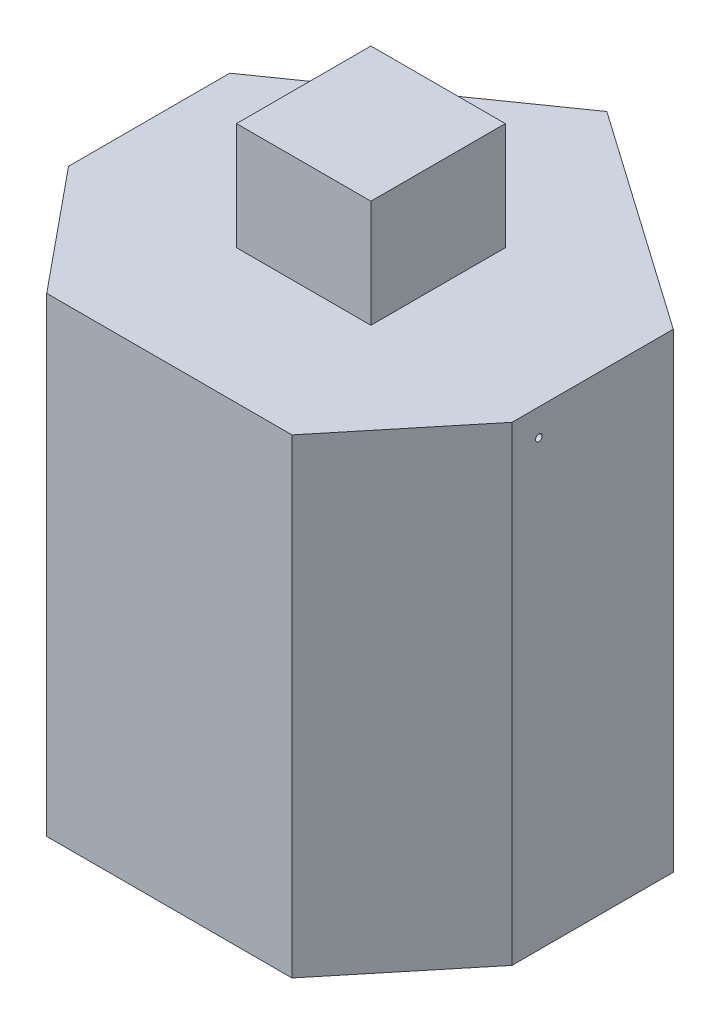
ISO-10303-21;
HEADER;
FILE_DESCRIPTION(('STEP AP214'),'2;1');
FILE_NAME('part.step','',(''),(''),'','','');
FILE_SCHEMA(('AUTOMOTIVE_DESIGN { 1 0 10303 214 1 1 1 1 }'));
ENDSEC;
DATA;
#1=APPLICATION_CONTEXT('core data for automotive mechanical design processes');
#2=APPLICATION_PROTOCOL_DEFINITION('international standard','automotive_design',2000,#1);
#3=PRODUCT_CONTEXT('',#1,'mechanical');
#4=PRODUCT('Part','Part','',(#3));
#5=PRODUCT_RELATED_PRODUCT_CATEGORY('part','',(#4));
#6=PRODUCT_DEFINITION_FORMATION('','',#4);
#7=PRODUCT_DEFINITION_CONTEXT('part definition',#1,'design');
#8=PRODUCT_DEFINITION('design','',#6,#7);
#9=PRODUCT_DEFINITION_SHAPE('','',#8);
#10=(LENGTH_UNIT() NAMED_UNIT(*) SI_UNIT(.MILLI.,.METRE.));
#11=(NAMED_UNIT(*) PLANE_ANGLE_UNIT() SI_UNIT($,.RADIAN.));
#12=(NAMED_UNIT(*) SI_UNIT($,.STERADIAN.) SOLID_ANGLE_UNIT());
#13=UNCERTAINTY_MEASURE_WITH_UNIT(LENGTH_MEASURE(1.E-05),#10,'distance_accuracy_value','');
#14=(GEOMETRIC_REPRESENTATION_CONTEXT(3) GLOBAL_UNCERTAINTY_ASSIGNED_CONTEXT((#13)) GLOBAL_UNIT_ASSIGNED_CONTEXT((#10,
#11,#12)) REPRESENTATION_CONTEXT('',''));
#15=CARTESIAN_POINT('',(0.,0.,0.));
#16=DIRECTION('',(0.,0.,1.));
#17=DIRECTION('',(1.,0.,0.));
#18=AXIS2_PLACEMENT_3D('',#15,#16,#17);
#19=CARTESIAN_POINT('',(0.,350.,0.));
#20=DIRECTION('',(0.,1.,0.));
#21=DIRECTION('',(0.,0.,1.));
#22=AXIS2_PLACEMENT_3D('',#19,#20,#21);
#23=PLANE('',#22);
#24=DIRECTION('',(-0.819067476795015,0.,-0.573697192303264));
#25=VECTOR('',#24,1.);
#26=CARTESIAN_POINT('',(0.,350.,-175.570498660794));
#27=LINE('',#26,#25);
#28=CARTESIAN_POINT('',(165.,350.,-60.));
#29=VERTEX_POINT('',#28);
#30=CARTESIAN_POINT('',(0.,350.,-175.570498660794));
#31=VERTEX_POINT('',#30);
#32=EDGE_CURVE('E189',#29,#31,#27,.T.);
#33=ORIENTED_EDGE('',*,*,#32,.T.);
#34=DIRECTION('',(-0.819067476795015,0.,0.573697192303264));
#35=VECTOR('',#34,1.);
#36=CARTESIAN_POINT('',(-165.,350.,-60.));
#37=LINE('',#36,#35);
#38=CARTESIAN_POINT('',(-165.,350.,-60.));
#39=VERTEX_POINT('',#38);
#40=EDGE_CURVE('E213',#31,#39,#37,.T.);
#41=ORIENTED_EDGE('',*,*,#40,.T.);
#42=DIRECTION('',(0.,0.,1.));
#43=VECTOR('',#42,1.);
#44=CARTESIAN_POINT('',(-165.,350.,60.));
#45=LINE('',#44,#43);
#46=CARTESIAN_POINT('',(-165.,350.,60.));
#47=VERTEX_POINT('',#46);
#48=EDGE_CURVE('E211',#39,#47,#45,.T.);
#49=ORIENTED_EDGE('',*,*,#48,.T.);
#50=DIRECTION('',(0.633866630860116,0.,0.773442366490255));
#51=VECTOR('',#50,1.);
#52=CARTESIAN_POINT('',(-165.,350.,60.));
#53=LINE('',#52,#51);
#54=CARTESIAN_POINT('',(-91.2414379544734,350.,150.));
#55=VERTEX_POINT('',#54);
#56=EDGE_CURVE('E209',#47,#55,#53,.T.);
#57=ORIENTED_EDGE('',*,*,#56,.T.);
#58=DIRECTION('',(1.,0.,0.));
#59=VECTOR('',#58,1.);
#60=CARTESIAN_POINT('',(-91.2414379544734,350.,150.));
#61=LINE('',#60,#59);
#62=CARTESIAN_POINT('',(91.2414379544733,350.,150.));
#63=VERTEX_POINT('',#62);
#64=EDGE_CURVE('E207',#55,#63,#61,.T.);
#65=ORIENTED_EDGE('',*,*,#64,.T.);
#66=DIRECTION('',(0.633866630860116,0.,-0.773442366490255));
#67=VECTOR('',#66,1.);
#68=CARTESIAN_POINT('',(91.2414379544733,350.,150.));
#69=LINE('',#68,#67);
#70=CARTESIAN_POINT('',(165.,350.,60.));
#71=VERTEX_POINT('',#70);
#72=EDGE_CURVE('E205',#63,#71,#69,.T.);
#73=ORIENTED_EDGE('',*,*,#72,.T.);
#74=DIRECTION('',(0.,0.,-1.));
#75=VECTOR('',#74,1.);
#76=CARTESIAN_POINT('',(165.,350.,60.));
#77=LINE('',#76,#75);
#78=EDGE_CURVE('E186',#71,#29,#77,.T.);
#79=ORIENTED_EDGE('',*,*,#78,.T.);
#80=EDGE_LOOP('',(#33,#41,#49,#57,#65,#73,#79));
#81=FACE_BOUND('',#80,.T.);
#82=DIRECTION('',(1.,0.,0.));
#83=VECTOR('',#82,1.);
#84=CARTESIAN_POINT('',(0.,350.,-50.));
#85=LINE('',#84,#83);
#86=CARTESIAN_POINT('',(-50.,350.,-50.));
#87=VERTEX_POINT('',#86);
#88=CARTESIAN_POINT('',(50.,350.,-50.));
#89=VERTEX_POINT('',#88);
#90=EDGE_CURVE('E219',#87,#89,#85,.T.);
#91=ORIENTED_EDGE('',*,*,#90,.T.);
#92=DIRECTION('',(0.,0.,1.));
#93=VECTOR('',#92,1.);
#94=CARTESIAN_POINT('',(50.,350.,0.));
#95=LINE('',#94,#93);
#96=CARTESIAN_POINT('',(50.,350.,50.));
#97=VERTEX_POINT('',#96);
#98=EDGE_CURVE('E203',#89,#97,#95,.T.);
#99=ORIENTED_EDGE('',*,*,#98,.T.);
#100=DIRECTION('',(-1.,0.,0.));
#101=VECTOR('',#100,1.);
#102=CARTESIAN_POINT('',(0.,350.,50.));
#103=LINE('',#102,#101);
#104=CARTESIAN_POINT('',(-50.,350.,50.));
#105=VERTEX_POINT('',#104);
#106=EDGE_CURVE('E225',#97,#105,#103,.T.);
#107=ORIENTED_EDGE('',*,*,#106,.T.);
#108=DIRECTION('',(0.,0.,-1.));
#109=VECTOR('',#108,1.);
#110=CARTESIAN_POINT('',(-50.,350.,0.));
#111=LINE('',#110,#109);
#112=EDGE_CURVE('E222',#105,#87,#111,.T.);
#113=ORIENTED_EDGE('',*,*,#112,.T.);
#114=EDGE_LOOP('',(#91,#99,#107,#113));
#115=FACE_BOUND('',#114,.T.);
#116=ADVANCED_FACE('F32',(#81,#115),#23,.T.);
#117=CARTESIAN_POINT('',(0.,350.,-175.570498660794));
#118=DIRECTION('',(-0.573697192303264,0.,0.819067476795015));
#119=DIRECTION('',(0.819067476795015,0.,0.573697192303264));
#120=AXIS2_PLACEMENT_3D('',#117,#118,#119);
#121=PLANE('',#120);
#122=DIRECTION('',(-0.819067476795015,0.,-0.573697192303264));
#123=VECTOR('',#122,1.);
#124=CARTESIAN_POINT('',(0.,0.,-175.570498660794));
#125=LINE('',#124,#123);
#126=CARTESIAN_POINT('',(165.,0.,-60.));
#127=VERTEX_POINT('',#126);
#128=CARTESIAN_POINT('',(79.3380004869838,0.,-120.));
#129=VERTEX_POINT('',#128);
#130=EDGE_CURVE('E200',#127,#129,#125,.T.);
#131=ORIENTED_EDGE('',*,*,#130,.T.);
#132=DIRECTION('',(0.,1.,0.));
#133=VECTOR('',#132,1.);
#134=CARTESIAN_POINT('',(79.3380004869838,350.,-120.));
#135=LINE('',#134,#133);
#136=CARTESIAN_POINT('',(79.3380004869837,280.,-120.));
#137=VERTEX_POINT('',#136);
#138=EDGE_CURVE('E47',#129,#137,#135,.T.);
#139=ORIENTED_EDGE('',*,*,#138,.T.);
#140=DIRECTION('',(0.819067476795015,0.,0.573697192303264));
#141=VECTOR('',#140,1.);
#142=CARTESIAN_POINT('',(0.,280.,-175.570498660794));
#143=LINE('',#142,#141);
#144=CARTESIAN_POINT('',(157.861500040582,280.,-65.));
#145=VERTEX_POINT('',#144);
#146=EDGE_CURVE('E152',#137,#145,#143,.T.);
#147=ORIENTED_EDGE('',*,*,#146,.T.);
#148=DIRECTION('',(0.,1.,0.));
#149=VECTOR('',#148,1.);
#150=CARTESIAN_POINT('',(157.861500040582,350.,-65.));
#151=LINE('',#150,#149);
#152=CARTESIAN_POINT('',(157.861500040582,340.,-65.));
#153=VERTEX_POINT('',#152);
#154=EDGE_CURVE('E248',#145,#153,#151,.T.);
#155=ORIENTED_EDGE('',*,*,#154,.T.);
#156=DIRECTION('',(-0.819067476795015,0.,-0.573697192303264));
#157=VECTOR('',#156,1.);
#158=CARTESIAN_POINT('',(0.,340.,-175.570498660794));
#159=LINE('',#158,#157);
#160=CARTESIAN_POINT('',(0.,340.,-175.570498660794));
#161=VERTEX_POINT('',#160);
#162=EDGE_CURVE('E251',#153,#161,#159,.T.);
#163=ORIENTED_EDGE('',*,*,#162,.T.);
#164=DIRECTION('',(0.,-1.,0.));
#165=VECTOR('',#164,1.);
#166=CARTESIAN_POINT('',(0.,350.,-175.570498660794));
#167=LINE('',#166,#165);
#168=EDGE_CURVE('E166',#31,#161,#167,.T.);
#169=ORIENTED_EDGE('',*,*,#168,.F.);
#170=ORIENTED_EDGE('',*,*,#32,.F.);
#171=DIRECTION('',(0.,-1.,0.));
#172=VECTOR('',#171,1.);
#173=CARTESIAN_POINT('',(165.,350.,-60.));
#174=LINE('',#173,#172);
#175=EDGE_CURVE('E183',#29,#127,#174,.T.);
#176=ORIENTED_EDGE('',*,*,#175,.T.);
#177=EDGE_LOOP('',(#131,#139,#147,#155,#163,#169,#170,#176));
#178=FACE_BOUND('',#177,.T.);
#179=ADVANCED_FACE('F34',(#178),#121,.F.);
#180=CARTESIAN_POINT('',(-165.,350.,-60.));
#181=DIRECTION('',(0.573697192303264,0.,0.819067476795015));
#182=DIRECTION('',(0.819067476795015,0.,-0.573697192303264));
#183=AXIS2_PLACEMENT_3D('',#180,#181,#182);
#184=PLANE('',#183);
#185=DIRECTION('',(0.819067476795015,0.,-0.573697192303264));
#186=VECTOR('',#185,1.);
#187=CARTESIAN_POINT('',(-165.,280.,-60.));
#188=LINE('',#187,#186);
#189=CARTESIAN_POINT('',(-157.861500040582,280.,-65.));
#190=VERTEX_POINT('',#189);
#191=CARTESIAN_POINT('',(-79.3380004869839,280.,-120.));
#192=VERTEX_POINT('',#191);
#193=EDGE_CURVE('E11',#190,#192,#188,.T.);
#194=ORIENTED_EDGE('',*,*,#193,.T.);
#195=DIRECTION('',(0.,-1.,0.));
#196=VECTOR('',#195,1.);
#197=CARTESIAN_POINT('',(-79.3380004869839,350.,-120.));
#198=LINE('',#197,#196);
#199=CARTESIAN_POINT('',(-79.3380004869839,0.,-120.));
#200=VERTEX_POINT('',#199);
#201=EDGE_CURVE('E139',#192,#200,#198,.T.);
#202=ORIENTED_EDGE('',*,*,#201,.T.);
#203=DIRECTION('',(-0.819067476795015,0.,0.573697192303264));
#204=VECTOR('',#203,1.);
#205=CARTESIAN_POINT('',(-165.,0.,-60.));
#206=LINE('',#205,#204);
#207=CARTESIAN_POINT('',(-165.,0.,-60.));
#208=VERTEX_POINT('',#207);
#209=EDGE_CURVE('E198',#200,#208,#206,.T.);
#210=ORIENTED_EDGE('',*,*,#209,.T.);
#211=DIRECTION('',(0.,-1.,0.));
#212=VECTOR('',#211,1.);
#213=CARTESIAN_POINT('',(-165.,350.,-60.));
#214=LINE('',#213,#212);
#215=EDGE_CURVE('E168',#39,#208,#214,.T.);
#216=ORIENTED_EDGE('',*,*,#215,.F.);
#217=ORIENTED_EDGE('',*,*,#40,.F.);
#218=ORIENTED_EDGE('',*,*,#168,.T.);
#219=DIRECTION('',(-0.819067476795015,0.,0.573697192303264));
#220=VECTOR('',#219,1.);
#221=CARTESIAN_POINT('',(-165.,340.,-60.));
#222=LINE('',#221,#220);
#223=CARTESIAN_POINT('',(-157.861500040582,340.,-65.));
#224=VERTEX_POINT('',#223);
#225=EDGE_CURVE('E159',#161,#224,#222,.T.);
#226=ORIENTED_EDGE('',*,*,#225,.T.);
#227=DIRECTION('',(0.,-1.,0.));
#228=VECTOR('',#227,1.);
#229=CARTESIAN_POINT('',(-157.861500040582,350.,-65.));
#230=LINE('',#229,#228);
#231=EDGE_CURVE('E40',#224,#190,#230,.T.);
#232=ORIENTED_EDGE('',*,*,#231,.T.);
#233=EDGE_LOOP('',(#194,#202,#210,#216,#217,#218,#226,#232));
#234=FACE_BOUND('',#233,.T.);
#235=ADVANCED_FACE('F156',(#234),#184,.F.);
#236=CARTESIAN_POINT('',(-165.,350.,60.));
#237=DIRECTION('',(1.,0.,0.));
#238=DIRECTION('',(0.,0.,-1.));
#239=AXIS2_PLACEMENT_3D('',#236,#237,#238);
#240=PLANE('',#239);
#241=CARTESIAN_POINT('',(-165.,330.,40.));
#242=DIRECTION('',(1.,0.,0.));
#243=DIRECTION('',(0.,0.,-1.));
#244=AXIS2_PLACEMENT_3D('',#241,#242,#243);
#245=CIRCLE('',#244,2.5);
#246=CARTESIAN_POINT('',(-165.,330.,37.5));
#247=VERTEX_POINT('',#246);
#248=EDGE_CURVE('E257',#247,#247,#245,.T.);
#249=ORIENTED_EDGE('',*,*,#248,.T.);
#250=EDGE_LOOP('',(#249));
#251=FACE_BOUND('',#250,.T.);
#252=DIRECTION('',(0.,0.,1.));
#253=VECTOR('',#252,1.);
#254=CARTESIAN_POINT('',(-165.,0.,60.));
#255=LINE('',#254,#253);
#256=CARTESIAN_POINT('',(-165.,0.,60.));
#257=VERTEX_POINT('',#256);
#258=EDGE_CURVE('E196',#208,#257,#255,.T.);
#259=ORIENTED_EDGE('',*,*,#258,.T.);
#260=DIRECTION('',(0.,-1.,0.));
#261=VECTOR('',#260,1.);
#262=CARTESIAN_POINT('',(-165.,350.,60.));
#263=LINE('',#262,#261);
#264=EDGE_CURVE('E171',#47,#257,#263,.T.);
#265=ORIENTED_EDGE('',*,*,#264,.F.);
#266=ORIENTED_EDGE('',*,*,#48,.F.);
#267=ORIENTED_EDGE('',*,*,#215,.T.);
#268=EDGE_LOOP('',(#259,#265,#266,#267));
#269=FACE_BOUND('',#268,.T.);
#270=ADVANCED_FACE('F265',(#251,#269),#240,.F.);
#271=CARTESIAN_POINT('',(-165.,350.,60.));
#272=DIRECTION('',(0.773442366490255,0.,-0.633866630860116));
#273=DIRECTION('',(-0.633866630860116,0.,-0.773442366490255));
#274=AXIS2_PLACEMENT_3D('',#271,#272,#273);
#275=PLANE('',#274);
#276=DIRECTION('',(0.633866630860116,0.,0.773442366490255));
#277=VECTOR('',#276,1.);
#278=CARTESIAN_POINT('',(-165.,0.,60.));
#279=LINE('',#278,#277);
#280=CARTESIAN_POINT('',(-91.2414379544734,0.,150.));
#281=VERTEX_POINT('',#280);
#282=EDGE_CURVE('E194',#257,#281,#279,.T.);
#283=ORIENTED_EDGE('',*,*,#282,.T.);
#284=DIRECTION('',(0.,-1.,0.));
#285=VECTOR('',#284,1.);
#286=CARTESIAN_POINT('',(-91.2414379544734,350.,150.));
#287=LINE('',#286,#285);
#288=EDGE_CURVE('E174',#55,#281,#287,.T.);
#289=ORIENTED_EDGE('',*,*,#288,.F.);
#290=ORIENTED_EDGE('',*,*,#56,.F.);
#291=ORIENTED_EDGE('',*,*,#264,.T.);
#292=EDGE_LOOP('',(#283,#289,#290,#291));
#293=FACE_BOUND('',#292,.T.);
#294=ADVANCED_FACE('F329',(#293),#275,.F.);
#295=CARTESIAN_POINT('',(-91.2414379544734,350.,150.));
#296=DIRECTION('',(0.,0.,-1.));
#297=DIRECTION('',(-1.,0.,0.));
#298=AXIS2_PLACEMENT_3D('',#295,#296,#297);
#299=PLANE('',#298);
#300=DIRECTION('',(1.,0.,0.));
#301=VECTOR('',#300,1.);
#302=CARTESIAN_POINT('',(-91.2414379544734,0.,150.));
#303=LINE('',#302,#301);
#304=CARTESIAN_POINT('',(91.2414379544733,0.,150.));
#305=VERTEX_POINT('',#304);
#306=EDGE_CURVE('E192',#281,#305,#303,.T.);
#307=ORIENTED_EDGE('',*,*,#306,.T.);
#308=DIRECTION('',(0.,-1.,0.));
#309=VECTOR('',#308,1.);
#310=CARTESIAN_POINT('',(91.2414379544733,350.,150.));
#311=LINE('',#310,#309);
#312=EDGE_CURVE('E177',#63,#305,#311,.T.);
#313=ORIENTED_EDGE('',*,*,#312,.F.);
#314=ORIENTED_EDGE('',*,*,#64,.F.);
#315=ORIENTED_EDGE('',*,*,#288,.T.);
#316=EDGE_LOOP('',(#307,#313,#314,#315));
#317=FACE_BOUND('',#316,.T.);
#318=ADVANCED_FACE('F325',(#317),#299,.F.);
#319=CARTESIAN_POINT('',(91.2414379544733,350.,150.));
#320=DIRECTION('',(-0.773442366490255,0.,-0.633866630860116));
#321=DIRECTION('',(-0.633866630860116,0.,0.773442366490255));
#322=AXIS2_PLACEMENT_3D('',#319,#320,#321);
#323=PLANE('',#322);
#324=DIRECTION('',(0.633866630860116,0.,-0.773442366490255));
#325=VECTOR('',#324,1.);
#326=CARTESIAN_POINT('',(91.2414379544733,0.,150.));
#327=LINE('',#326,#325);
#328=CARTESIAN_POINT('',(165.,0.,60.));
#329=VERTEX_POINT('',#328);
#330=EDGE_CURVE('E190',#305,#329,#327,.T.);
#331=ORIENTED_EDGE('',*,*,#330,.T.);
#332=DIRECTION('',(0.,-1.,0.));
#333=VECTOR('',#332,1.);
#334=CARTESIAN_POINT('',(165.,350.,60.));
#335=LINE('',#334,#333);
#336=EDGE_CURVE('E180',#71,#329,#335,.T.);
#337=ORIENTED_EDGE('',*,*,#336,.F.);
#338=ORIENTED_EDGE('',*,*,#72,.F.);
#339=ORIENTED_EDGE('',*,*,#312,.T.);
#340=EDGE_LOOP('',(#331,#337,#338,#339));
#341=FACE_BOUND('',#340,.T.);
#342=ADVANCED_FACE('F278',(#341),#323,.F.);
#343=CARTESIAN_POINT('',(165.,350.,60.));
#344=DIRECTION('',(-1.,0.,0.));
#345=DIRECTION('',(0.,0.,1.));
#346=AXIS2_PLACEMENT_3D('',#343,#344,#345);
#347=PLANE('',#346);
#348=CARTESIAN_POINT('',(165.,330.,40.));
#349=DIRECTION('',(1.,0.,0.));
#350=DIRECTION('',(0.,0.,-1.));
#351=AXIS2_PLACEMENT_3D('',#348,#349,#350);
#352=CIRCLE('',#351,2.5);
#353=CARTESIAN_POINT('',(165.,330.,37.5));
#354=VERTEX_POINT('',#353);
#355=EDGE_CURVE('E259',#354,#354,#352,.T.);
#356=ORIENTED_EDGE('',*,*,#355,.F.);
#357=EDGE_LOOP('',(#356));
#358=FACE_BOUND('',#357,.T.);
#359=DIRECTION('',(0.,0.,-1.));
#360=VECTOR('',#359,1.);
#361=CARTESIAN_POINT('',(165.,0.,60.));
#362=LINE('',#361,#360);
#363=EDGE_CURVE('E187',#329,#127,#362,.T.);
#364=ORIENTED_EDGE('',*,*,#363,.T.);
#365=ORIENTED_EDGE('',*,*,#175,.F.);
#366=ORIENTED_EDGE('',*,*,#78,.F.);
#367=ORIENTED_EDGE('',*,*,#336,.T.);
#368=EDGE_LOOP('',(#364,#365,#366,#367));
#369=FACE_BOUND('',#368,.T.);
#370=ADVANCED_FACE('F274',(#358,#369),#347,.F.);
#371=CARTESIAN_POINT('',(0.,0.,0.));
#372=DIRECTION('',(0.,1.,0.));
#373=DIRECTION('',(0.,0.,1.));
#374=AXIS2_PLACEMENT_3D('',#371,#372,#373);
#375=PLANE('',#374);
#376=ORIENTED_EDGE('',*,*,#209,.F.);
#377=DIRECTION('',(1.,0.,0.));
#378=VECTOR('',#377,1.);
#379=CARTESIAN_POINT('',(0.,0.,-120.));
#380=LINE('',#379,#378);
#381=EDGE_CURVE('E143',#200,#129,#380,.T.);
#382=ORIENTED_EDGE('',*,*,#381,.T.);
#383=ORIENTED_EDGE('',*,*,#130,.F.);
#384=ORIENTED_EDGE('',*,*,#363,.F.);
#385=ORIENTED_EDGE('',*,*,#330,.F.);
#386=ORIENTED_EDGE('',*,*,#306,.F.);
#387=ORIENTED_EDGE('',*,*,#282,.F.);
#388=ORIENTED_EDGE('',*,*,#258,.F.);
#389=EDGE_LOOP('',(#376,#382,#383,#384,#385,#386,#387,#388));
#390=FACE_BOUND('',#389,.T.);
#391=ADVANCED_FACE('F277',(#390),#375,.F.);
#392=CARTESIAN_POINT('',(50.,430.,50.));
#393=DIRECTION('',(-1.,0.,0.));
#394=DIRECTION('',(0.,0.,1.));
#395=AXIS2_PLACEMENT_3D('',#392,#393,#394);
#396=PLANE('',#395);
#397=ORIENTED_EDGE('',*,*,#98,.F.);
#398=DIRECTION('',(0.,-1.,0.));
#399=VECTOR('',#398,1.);
#400=CARTESIAN_POINT('',(50.,430.,-50.));
#401=LINE('',#400,#399);
#402=CARTESIAN_POINT('',(50.,430.,-50.));
#403=VERTEX_POINT('',#402);
#404=EDGE_CURVE('E228',#403,#89,#401,.T.);
#405=ORIENTED_EDGE('',*,*,#404,.F.);
#406=DIRECTION('',(0.,0.,-1.));
#407=VECTOR('',#406,1.);
#408=CARTESIAN_POINT('',(50.,430.,50.));
#409=LINE('',#408,#407);
#410=CARTESIAN_POINT('',(50.,430.,50.));
#411=VERTEX_POINT('',#410);
#412=EDGE_CURVE('E244',#411,#403,#409,.T.);
#413=ORIENTED_EDGE('',*,*,#412,.F.);
#414=DIRECTION('',(0.,-1.,0.));
#415=VECTOR('',#414,1.);
#416=CARTESIAN_POINT('',(50.,430.,50.));
#417=LINE('',#416,#415);
#418=EDGE_CURVE('E235',#411,#97,#417,.T.);
#419=ORIENTED_EDGE('',*,*,#418,.T.);
#420=EDGE_LOOP('',(#397,#405,#413,#419));
#421=FACE_BOUND('',#420,.T.);
#422=ADVANCED_FACE('F319',(#421),#396,.F.);
#423=CARTESIAN_POINT('',(-50.,430.,-50.));
#424=DIRECTION('',(0.,0.,1.));
#425=DIRECTION('',(1.,0.,0.));
#426=AXIS2_PLACEMENT_3D('',#423,#424,#425);
#427=PLANE('',#426);
#428=ORIENTED_EDGE('',*,*,#90,.F.);
#429=DIRECTION('',(0.,-1.,0.));
#430=VECTOR('',#429,1.);
#431=CARTESIAN_POINT('',(-50.,430.,-50.));
#432=LINE('',#431,#430);
#433=CARTESIAN_POINT('',(-50.,430.,-50.));
#434=VERTEX_POINT('',#433);
#435=EDGE_CURVE('E231',#434,#87,#432,.T.);
#436=ORIENTED_EDGE('',*,*,#435,.F.);
#437=DIRECTION('',(-1.,0.,0.));
#438=VECTOR('',#437,1.);
#439=CARTESIAN_POINT('',(-50.,430.,-50.));
#440=LINE('',#439,#438);
#441=EDGE_CURVE('E242',#403,#434,#440,.T.);
#442=ORIENTED_EDGE('',*,*,#441,.F.);
#443=ORIENTED_EDGE('',*,*,#404,.T.);
#444=EDGE_LOOP('',(#428,#436,#442,#443));
#445=FACE_BOUND('',#444,.T.);
#446=ADVANCED_FACE('F423',(#445),#427,.F.);
#447=CARTESIAN_POINT('',(-50.,430.,50.));
#448=DIRECTION('',(1.,0.,0.));
#449=DIRECTION('',(0.,0.,-1.));
#450=AXIS2_PLACEMENT_3D('',#447,#448,#449);
#451=PLANE('',#450);
#452=ORIENTED_EDGE('',*,*,#112,.F.);
#453=DIRECTION('',(0.,-1.,0.));
#454=VECTOR('',#453,1.);
#455=CARTESIAN_POINT('',(-50.,430.,50.));
#456=LINE('',#455,#454);
#457=CARTESIAN_POINT('',(-50.,430.,50.));
#458=VERTEX_POINT('',#457);
#459=EDGE_CURVE('E55',#458,#105,#456,.T.);
#460=ORIENTED_EDGE('',*,*,#459,.F.);
#461=DIRECTION('',(0.,0.,1.));
#462=VECTOR('',#461,1.);
#463=CARTESIAN_POINT('',(-50.,430.,50.));
#464=LINE('',#463,#462);
#465=EDGE_CURVE('E240',#434,#458,#464,.T.);
#466=ORIENTED_EDGE('',*,*,#465,.F.);
#467=ORIENTED_EDGE('',*,*,#435,.T.);
#468=EDGE_LOOP('',(#452,#460,#466,#467));
#469=FACE_BOUND('',#468,.T.);
#470=ADVANCED_FACE('F432',(#469),#451,.F.);
#471=CARTESIAN_POINT('',(-50.,430.,50.));
#472=DIRECTION('',(0.,0.,-1.));
#473=DIRECTION('',(-1.,0.,0.));
#474=AXIS2_PLACEMENT_3D('',#471,#472,#473);
#475=PLANE('',#474);
#476=ORIENTED_EDGE('',*,*,#106,.F.);
#477=ORIENTED_EDGE('',*,*,#418,.F.);
#478=DIRECTION('',(1.,0.,0.));
#479=VECTOR('',#478,1.);
#480=CARTESIAN_POINT('',(-50.,430.,50.));
#481=LINE('',#480,#479);
#482=EDGE_CURVE('E238',#458,#411,#481,.T.);
#483=ORIENTED_EDGE('',*,*,#482,.F.);
#484=ORIENTED_EDGE('',*,*,#459,.T.);
#485=EDGE_LOOP('',(#476,#477,#483,#484));
#486=FACE_BOUND('',#485,.T.);
#487=ADVANCED_FACE('F441',(#486),#475,.F.);
#488=CARTESIAN_POINT('',(0.,430.,0.));
#489=DIRECTION('',(0.,-1.,0.));
#490=DIRECTION('',(0.,0.,-1.));
#491=AXIS2_PLACEMENT_3D('',#488,#489,#490);
#492=PLANE('',#491);
#493=ORIENTED_EDGE('',*,*,#412,.T.);
#494=ORIENTED_EDGE('',*,*,#441,.T.);
#495=ORIENTED_EDGE('',*,*,#465,.T.);
#496=ORIENTED_EDGE('',*,*,#482,.T.);
#497=EDGE_LOOP('',(#493,#494,#495,#496));
#498=FACE_BOUND('',#497,.T.);
#499=ADVANCED_FACE('F309',(#498),#492,.F.);
#500=CARTESIAN_POINT('',(-165.,280.,-120.));
#501=DIRECTION('',(0.,-1.,0.));
#502=DIRECTION('',(0.,0.,-1.));
#503=AXIS2_PLACEMENT_3D('',#500,#501,#502);
#504=PLANE('',#503);
#505=DIRECTION('',(1.,0.,0.));
#506=VECTOR('',#505,1.);
#507=CARTESIAN_POINT('',(-165.,280.,-120.));
#508=LINE('',#507,#506);
#509=EDGE_CURVE('E142',#192,#137,#508,.T.);
#510=ORIENTED_EDGE('',*,*,#509,.F.);
#511=ORIENTED_EDGE('',*,*,#193,.F.);
#512=DIRECTION('',(1.,0.,0.));
#513=VECTOR('',#512,1.);
#514=CARTESIAN_POINT('',(-165.,280.,-65.));
#515=LINE('',#514,#513);
#516=EDGE_CURVE('E153',#190,#145,#515,.T.);
#517=ORIENTED_EDGE('',*,*,#516,.T.);
#518=ORIENTED_EDGE('',*,*,#146,.F.);
#519=EDGE_LOOP('',(#510,#511,#517,#518));
#520=FACE_BOUND('',#519,.T.);
#521=ADVANCED_FACE('F148',(#520),#504,.F.);
#522=CARTESIAN_POINT('',(-165.,340.,-65.));
#523=DIRECTION('',(0.,0.,1.));
#524=DIRECTION('',(0.,-1.,0.));
#525=AXIS2_PLACEMENT_3D('',#522,#523,#524);
#526=PLANE('',#525);
#527=ORIENTED_EDGE('',*,*,#516,.F.);
#528=ORIENTED_EDGE('',*,*,#231,.F.);
#529=DIRECTION('',(1.,0.,0.));
#530=VECTOR('',#529,1.);
#531=CARTESIAN_POINT('',(-165.,340.,-65.));
#532=LINE('',#531,#530);
#533=EDGE_CURVE('E255',#224,#153,#532,.T.);
#534=ORIENTED_EDGE('',*,*,#533,.T.);
#535=ORIENTED_EDGE('',*,*,#154,.F.);
#536=EDGE_LOOP('',(#527,#528,#534,#535));
#537=FACE_BOUND('',#536,.T.);
#538=ADVANCED_FACE('F301',(#537),#526,.F.);
#539=CARTESIAN_POINT('',(-165.,340.,-175.570498660794));
#540=DIRECTION('',(0.,1.,0.));
#541=DIRECTION('',(0.,0.,1.));
#542=AXIS2_PLACEMENT_3D('',#539,#540,#541);
#543=PLANE('',#542);
#544=ORIENTED_EDGE('',*,*,#533,.F.);
#545=ORIENTED_EDGE('',*,*,#225,.F.);
#546=ORIENTED_EDGE('',*,*,#162,.F.);
#547=EDGE_LOOP('',(#544,#545,#546));
#548=FACE_BOUND('',#547,.T.);
#549=ADVANCED_FACE('F300',(#548),#543,.F.);
#550=CARTESIAN_POINT('',(-165.,0.,-120.));
#551=DIRECTION('',(0.,0.,1.));
#552=DIRECTION('',(1.,0.,0.));
#553=AXIS2_PLACEMENT_3D('',#550,#551,#552);
#554=PLANE('',#553);
#555=ORIENTED_EDGE('',*,*,#381,.F.);
#556=ORIENTED_EDGE('',*,*,#201,.F.);
#557=ORIENTED_EDGE('',*,*,#509,.T.);
#558=ORIENTED_EDGE('',*,*,#138,.F.);
#559=EDGE_LOOP('',(#555,#556,#557,#558));
#560=FACE_BOUND('',#559,.T.);
#561=ADVANCED_FACE('F141',(#560),#554,.F.);
#562=CARTESIAN_POINT('',(-165.,330.,40.));
#563=DIRECTION('',(1.,0.,0.));
#564=DIRECTION('',(0.,0.,-1.));
#565=AXIS2_PLACEMENT_3D('',#562,#563,#564);
#566=CYLINDRICAL_SURFACE('',#565,2.5);
#567=ORIENTED_EDGE('',*,*,#248,.F.);
#568=EDGE_LOOP('',(#567));
#569=FACE_BOUND('',#568,.T.);
#570=ORIENTED_EDGE('',*,*,#355,.T.);
#571=EDGE_LOOP('',(#570));
#572=FACE_BOUND('',#571,.T.);
#573=ADVANCED_FACE('F268',(#569,#572),#566,.F.);
#574=CLOSED_SHELL('',(#116,#179,#235,#270,#294,#318,#342,#370,#391,#422,#446,#470,#487,#499,
#521,#538,#549,#561,#573));
#575=MANIFOLD_SOLID_BREP('B2',#574);
#576=ADVANCED_BREP_SHAPE_REPRESENTATION('',(#18,#575),#14);
#577=SHAPE_DEFINITION_REPRESENTATION(#9,#576);
ENDSEC;
END-ISO-10303-21;
